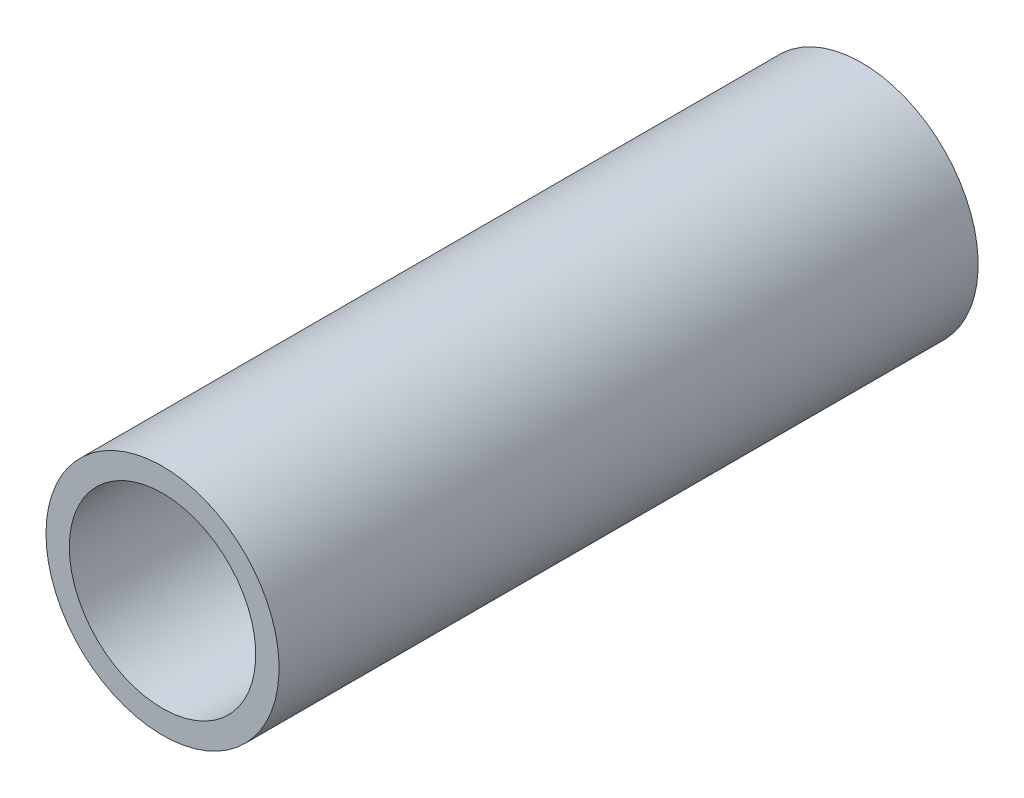
ISO-10303-21;
HEADER;
FILE_DESCRIPTION(('STEP AP214'),'2;1');
FILE_NAME('part.step','',(''),(''),'','','');
FILE_SCHEMA(('AUTOMOTIVE_DESIGN { 1 0 10303 214 1 1 1 1 }'));
ENDSEC;
DATA;
#1=APPLICATION_CONTEXT('core data for automotive mechanical design processes');
#2=APPLICATION_PROTOCOL_DEFINITION('international standard','automotive_design',2000,#1);
#3=PRODUCT_CONTEXT('',#1,'mechanical');
#4=PRODUCT('Part','Part','',(#3));
#5=PRODUCT_RELATED_PRODUCT_CATEGORY('part','',(#4));
#6=PRODUCT_DEFINITION_FORMATION('','',#4);
#7=PRODUCT_DEFINITION_CONTEXT('part definition',#1,'design');
#8=PRODUCT_DEFINITION('design','',#6,#7);
#9=PRODUCT_DEFINITION_SHAPE('','',#8);
#10=(LENGTH_UNIT() NAMED_UNIT(*) SI_UNIT(.MILLI.,.METRE.));
#11=(NAMED_UNIT(*) PLANE_ANGLE_UNIT() SI_UNIT($,.RADIAN.));
#12=(NAMED_UNIT(*) SI_UNIT($,.STERADIAN.) SOLID_ANGLE_UNIT());
#13=UNCERTAINTY_MEASURE_WITH_UNIT(LENGTH_MEASURE(1.E-05),#10,'distance_accuracy_value','');
#14=(GEOMETRIC_REPRESENTATION_CONTEXT(3) GLOBAL_UNCERTAINTY_ASSIGNED_CONTEXT((#13)) GLOBAL_UNIT_ASSIGNED_CONTEXT((#10,
#11,#12)) REPRESENTATION_CONTEXT('',''));
#15=CARTESIAN_POINT('',(0.,0.,0.));
#16=DIRECTION('',(0.,0.,1.));
#17=DIRECTION('',(1.,0.,0.));
#18=AXIS2_PLACEMENT_3D('',#15,#16,#17);
#19=CARTESIAN_POINT('',(0.,0.,45.));
#20=DIRECTION('',(0.,0.,1.));
#21=DIRECTION('',(1.,0.,0.));
#22=AXIS2_PLACEMENT_3D('',#19,#20,#21);
#23=PLANE('',#22);
#24=CARTESIAN_POINT('',(0.,0.,45.));
#25=DIRECTION('',(0.,0.,1.));
#26=DIRECTION('',(1.,0.,0.));
#27=AXIS2_PLACEMENT_3D('',#24,#25,#26);
#28=CIRCLE('',#27,7.5);
#29=CARTESIAN_POINT('',(-7.5,0.,45.));
#30=VERTEX_POINT('',#29);
#31=EDGE_CURVE('E10',#30,#30,#28,.T.);
#32=ORIENTED_EDGE('',*,*,#31,.T.);
#33=EDGE_LOOP('',(#32));
#34=FACE_BOUND('',#33,.T.);
#35=CARTESIAN_POINT('',(0.,0.,45.));
#36=DIRECTION('',(0.,0.,1.));
#37=DIRECTION('',(1.,0.,0.));
#38=AXIS2_PLACEMENT_3D('',#35,#36,#37);
#39=CIRCLE('',#38,6.);
#40=CARTESIAN_POINT('',(-6.,0.,45.));
#41=VERTEX_POINT('',#40);
#42=EDGE_CURVE('E42',#41,#41,#39,.T.);
#43=ORIENTED_EDGE('',*,*,#42,.F.);
#44=EDGE_LOOP('',(#43));
#45=FACE_BOUND('',#44,.T.);
#46=ADVANCED_FACE('F31',(#34,#45),#23,.T.);
#47=CARTESIAN_POINT('',(0.,0.,0.));
#48=DIRECTION('',(0.,0.,1.));
#49=DIRECTION('',(1.,0.,0.));
#50=AXIS2_PLACEMENT_3D('',#47,#48,#49);
#51=PLANE('',#50);
#52=CARTESIAN_POINT('',(0.,0.,0.));
#53=DIRECTION('',(0.,0.,1.));
#54=DIRECTION('',(1.,0.,0.));
#55=AXIS2_PLACEMENT_3D('',#52,#53,#54);
#56=CIRCLE('',#55,7.5);
#57=CARTESIAN_POINT('',(-7.5,0.,0.));
#58=VERTEX_POINT('',#57);
#59=EDGE_CURVE('E35',#58,#58,#56,.T.);
#60=ORIENTED_EDGE('',*,*,#59,.F.);
#61=EDGE_LOOP('',(#60));
#62=FACE_BOUND('',#61,.T.);
#63=CARTESIAN_POINT('',(0.,0.,0.));
#64=DIRECTION('',(0.,0.,1.));
#65=DIRECTION('',(1.,0.,0.));
#66=AXIS2_PLACEMENT_3D('',#63,#64,#65);
#67=CIRCLE('',#66,6.);
#68=CARTESIAN_POINT('',(-6.,0.,0.));
#69=VERTEX_POINT('',#68);
#70=EDGE_CURVE('E44',#69,#69,#67,.T.);
#71=ORIENTED_EDGE('',*,*,#70,.T.);
#72=EDGE_LOOP('',(#71));
#73=FACE_BOUND('',#72,.T.);
#74=ADVANCED_FACE('F54',(#62,#73),#51,.F.);
#75=CARTESIAN_POINT('',(0.,0.,45.));
#76=DIRECTION('',(0.,0.,-1.));
#77=DIRECTION('',(-1.,0.,0.));
#78=AXIS2_PLACEMENT_3D('',#75,#76,#77);
#79=CYLINDRICAL_SURFACE('',#78,7.5);
#80=CARTESIAN_POINT('',(-7.5,0.,45.));
#81=CARTESIAN_POINT('',(-7.5,0.,44.53125));
#82=CARTESIAN_POINT('',(-7.5,0.,44.0625));
#83=CARTESIAN_POINT('',(-7.5,0.,43.125));
#84=CARTESIAN_POINT('',(-7.5,0.,42.65625));
#85=CARTESIAN_POINT('',(-7.5,0.,41.71875));
#86=CARTESIAN_POINT('',(-7.5,0.,41.25));
#87=CARTESIAN_POINT('',(-7.5,0.,40.3125));
#88=CARTESIAN_POINT('',(-7.5,0.,39.84375));
#89=CARTESIAN_POINT('',(-7.5,0.,38.90625));
#90=CARTESIAN_POINT('',(-7.5,0.,38.4375));
#91=CARTESIAN_POINT('',(-7.5,0.,37.5));
#92=CARTESIAN_POINT('',(-7.5,0.,37.03125));
#93=CARTESIAN_POINT('',(-7.5,0.,36.09375));
#94=CARTESIAN_POINT('',(-7.5,0.,35.625));
#95=CARTESIAN_POINT('',(-7.5,0.,34.6875));
#96=CARTESIAN_POINT('',(-7.5,0.,34.21875));
#97=CARTESIAN_POINT('',(-7.5,0.,33.28125));
#98=CARTESIAN_POINT('',(-7.5,0.,32.8125));
#99=CARTESIAN_POINT('',(-7.5,0.,31.875));
#100=CARTESIAN_POINT('',(-7.5,0.,31.40625));
#101=CARTESIAN_POINT('',(-7.5,0.,30.46875));
#102=CARTESIAN_POINT('',(-7.5,0.,30.));
#103=CARTESIAN_POINT('',(-7.5,0.,29.0625));
#104=CARTESIAN_POINT('',(-7.5,0.,28.59375));
#105=CARTESIAN_POINT('',(-7.5,0.,27.65625));
#106=CARTESIAN_POINT('',(-7.5,0.,27.1875));
#107=CARTESIAN_POINT('',(-7.5,0.,26.25));
#108=CARTESIAN_POINT('',(-7.5,0.,25.78125));
#109=CARTESIAN_POINT('',(-7.5,0.,24.84375));
#110=CARTESIAN_POINT('',(-7.5,0.,24.375));
#111=CARTESIAN_POINT('',(-7.5,0.,23.4375));
#112=CARTESIAN_POINT('',(-7.5,0.,22.96875));
#113=CARTESIAN_POINT('',(-7.5,0.,22.03125));
#114=CARTESIAN_POINT('',(-7.5,0.,21.5625));
#115=CARTESIAN_POINT('',(-7.5,0.,20.625));
#116=CARTESIAN_POINT('',(-7.5,0.,20.15625));
#117=CARTESIAN_POINT('',(-7.5,0.,19.21875));
#118=CARTESIAN_POINT('',(-7.5,0.,18.75));
#119=CARTESIAN_POINT('',(-7.5,0.,17.8125));
#120=CARTESIAN_POINT('',(-7.5,0.,17.34375));
#121=CARTESIAN_POINT('',(-7.5,0.,16.40625));
#122=CARTESIAN_POINT('',(-7.5,0.,15.9375));
#123=CARTESIAN_POINT('',(-7.5,0.,15.));
#124=CARTESIAN_POINT('',(-7.5,0.,14.53125));
#125=CARTESIAN_POINT('',(-7.5,0.,13.59375));
#126=CARTESIAN_POINT('',(-7.5,0.,13.125));
#127=CARTESIAN_POINT('',(-7.5,0.,12.1875));
#128=CARTESIAN_POINT('',(-7.5,0.,11.71875));
#129=CARTESIAN_POINT('',(-7.5,0.,10.78125));
#130=CARTESIAN_POINT('',(-7.5,0.,10.3125));
#131=CARTESIAN_POINT('',(-7.5,0.,9.37499999999999));
#132=CARTESIAN_POINT('',(-7.5,0.,8.90624999999999));
#133=CARTESIAN_POINT('',(-7.5,0.,7.96874999999999));
#134=CARTESIAN_POINT('',(-7.5,0.,7.5));
#135=CARTESIAN_POINT('',(-7.5,0.,6.56249999999999));
#136=CARTESIAN_POINT('',(-7.5,0.,6.09374999999999));
#137=CARTESIAN_POINT('',(-7.5,0.,5.15624999999999));
#138=CARTESIAN_POINT('',(-7.5,0.,4.68749999999999));
#139=CARTESIAN_POINT('',(-7.5,0.,3.74999999999999));
#140=CARTESIAN_POINT('',(-7.5,0.,3.28124999999999));
#141=CARTESIAN_POINT('',(-7.5,0.,2.34374999999999));
#142=CARTESIAN_POINT('',(-7.5,0.,1.87499999999999));
#143=CARTESIAN_POINT('',(-7.5,0.,0.937499999999992));
#144=CARTESIAN_POINT('',(-7.5,0.,0.468749999999993));
#145=CARTESIAN_POINT('',(-7.5,0.,0.));
#146=B_SPLINE_CURVE_WITH_KNOTS('',3,(#80,#81,#82,#83,#84,#85,#86,#87,#88,#89,#90,#91,#92,#93,
#94,#95,#96,#97,#98,#99,#100,#101,#102,#103,#104,#105,#106,#107,#108,#109,#110,#111,#112,#113,
#114,#115,#116,#117,#118,#119,#120,#121,#122,#123,#124,#125,#126,#127,#128,#129,#130,#131,#132,
#133,#134,#135,#136,#137,#138,#139,#140,#141,#142,#143,#144,#145),.UNSPECIFIED.,.F.,.F.,(4,2,2,
2,2,2,2,2,2,2,2,2,2,2,2,2,2,2,2,2,2,2,2,2,2,2,2,2,2,2,2,2,4),(0.,1.40625,2.8125,
4.21874999999999,5.625,7.03125,8.43749999999999,9.84375,11.25,12.65625,14.0625,15.46875,16.875,
18.28125,19.6875,21.09375,22.5,23.90625,25.3125,26.71875,28.125,29.53125,30.9375,32.34375,33.75,
35.15625,36.5625,37.96875,39.375,40.78125,42.1875,43.59375,45.),.UNSPECIFIED.);
#147=EDGE_CURVE('BSEAM33',#30,#58,#146,.T.);
#148=ORIENTED_EDGE('',*,*,#31,.F.);
#149=ORIENTED_EDGE('',*,*,#59,.T.);
#150=ORIENTED_EDGE('',*,*,#147,.T.);
#151=ORIENTED_EDGE('',*,*,#147,.F.);
#152=EDGE_LOOP('',(#148,#150,#149,#151));
#153=FACE_BOUND('',#152,.T.);
#154=ADVANCED_FACE('F33',(#153),#79,.T.);
#155=CARTESIAN_POINT('',(0.,0.,45.));
#156=DIRECTION('',(0.,0.,-1.));
#157=DIRECTION('',(-1.,0.,0.));
#158=AXIS2_PLACEMENT_3D('',#155,#156,#157);
#159=CYLINDRICAL_SURFACE('',#158,6.);
#160=CARTESIAN_POINT('',(-6.,0.,45.));
#161=CARTESIAN_POINT('',(-6.,0.,44.53125));
#162=CARTESIAN_POINT('',(-6.,0.,44.0625));
#163=CARTESIAN_POINT('',(-6.,0.,43.125));
#164=CARTESIAN_POINT('',(-6.,0.,42.65625));
#165=CARTESIAN_POINT('',(-6.,0.,41.71875));
#166=CARTESIAN_POINT('',(-6.,0.,41.25));
#167=CARTESIAN_POINT('',(-6.,0.,40.3125));
#168=CARTESIAN_POINT('',(-6.,0.,39.84375));
#169=CARTESIAN_POINT('',(-6.,0.,38.90625));
#170=CARTESIAN_POINT('',(-6.,0.,38.4375));
#171=CARTESIAN_POINT('',(-6.,0.,37.5));
#172=CARTESIAN_POINT('',(-6.,0.,37.03125));
#173=CARTESIAN_POINT('',(-6.,0.,36.09375));
#174=CARTESIAN_POINT('',(-6.,0.,35.625));
#175=CARTESIAN_POINT('',(-6.,0.,34.6875));
#176=CARTESIAN_POINT('',(-6.,0.,34.21875));
#177=CARTESIAN_POINT('',(-6.,0.,33.28125));
#178=CARTESIAN_POINT('',(-6.,0.,32.8125));
#179=CARTESIAN_POINT('',(-6.,0.,31.875));
#180=CARTESIAN_POINT('',(-6.,0.,31.40625));
#181=CARTESIAN_POINT('',(-6.,0.,30.46875));
#182=CARTESIAN_POINT('',(-6.,0.,30.));
#183=CARTESIAN_POINT('',(-6.,0.,29.0625));
#184=CARTESIAN_POINT('',(-6.,0.,28.59375));
#185=CARTESIAN_POINT('',(-6.,0.,27.65625));
#186=CARTESIAN_POINT('',(-6.,0.,27.1875));
#187=CARTESIAN_POINT('',(-6.,0.,26.25));
#188=CARTESIAN_POINT('',(-6.,0.,25.78125));
#189=CARTESIAN_POINT('',(-6.,0.,24.84375));
#190=CARTESIAN_POINT('',(-6.,0.,24.375));
#191=CARTESIAN_POINT('',(-6.,0.,23.4375));
#192=CARTESIAN_POINT('',(-6.,0.,22.96875));
#193=CARTESIAN_POINT('',(-6.,0.,22.03125));
#194=CARTESIAN_POINT('',(-6.,0.,21.5625));
#195=CARTESIAN_POINT('',(-6.,0.,20.625));
#196=CARTESIAN_POINT('',(-6.,0.,20.15625));
#197=CARTESIAN_POINT('',(-6.,0.,19.21875));
#198=CARTESIAN_POINT('',(-6.,0.,18.75));
#199=CARTESIAN_POINT('',(-6.,0.,17.8125));
#200=CARTESIAN_POINT('',(-6.,0.,17.34375));
#201=CARTESIAN_POINT('',(-6.,0.,16.40625));
#202=CARTESIAN_POINT('',(-6.,0.,15.9375));
#203=CARTESIAN_POINT('',(-6.,0.,15.));
#204=CARTESIAN_POINT('',(-6.,0.,14.53125));
#205=CARTESIAN_POINT('',(-6.,0.,13.59375));
#206=CARTESIAN_POINT('',(-6.,0.,13.125));
#207=CARTESIAN_POINT('',(-6.,0.,12.1875));
#208=CARTESIAN_POINT('',(-6.,0.,11.71875));
#209=CARTESIAN_POINT('',(-6.,0.,10.78125));
#210=CARTESIAN_POINT('',(-6.,0.,10.3125));
#211=CARTESIAN_POINT('',(-6.,0.,9.37499999999999));
#212=CARTESIAN_POINT('',(-6.,0.,8.90624999999999));
#213=CARTESIAN_POINT('',(-6.,0.,7.96874999999999));
#214=CARTESIAN_POINT('',(-6.,0.,7.5));
#215=CARTESIAN_POINT('',(-6.,0.,6.56249999999999));
#216=CARTESIAN_POINT('',(-6.,0.,6.09374999999999));
#217=CARTESIAN_POINT('',(-6.,0.,5.15624999999999));
#218=CARTESIAN_POINT('',(-6.,0.,4.68749999999999));
#219=CARTESIAN_POINT('',(-6.,0.,3.74999999999999));
#220=CARTESIAN_POINT('',(-6.,0.,3.28124999999999));
#221=CARTESIAN_POINT('',(-6.,0.,2.34374999999999));
#222=CARTESIAN_POINT('',(-6.,0.,1.87499999999999));
#223=CARTESIAN_POINT('',(-6.,0.,0.937499999999992));
#224=CARTESIAN_POINT('',(-6.,0.,0.468749999999993));
#225=CARTESIAN_POINT('',(-6.,0.,0.));
#226=B_SPLINE_CURVE_WITH_KNOTS('',3,(#160,#161,#162,#163,#164,#165,#166,#167,#168,#169,#170,
#171,#172,#173,#174,#175,#176,#177,#178,#179,#180,#181,#182,#183,#184,#185,#186,#187,#188,#189,
#190,#191,#192,#193,#194,#195,#196,#197,#198,#199,#200,#201,#202,#203,#204,#205,#206,#207,#208,
#209,#210,#211,#212,#213,#214,#215,#216,#217,#218,#219,#220,#221,#222,#223,#224,#225),
.UNSPECIFIED.,.F.,.F.,(4,2,2,2,2,2,2,2,2,2,2,2,2,2,2,2,2,2,2,2,2,2,2,2,2,2,2,2,2,2,2,2,4),(0.,
1.40625,2.8125,4.21874999999999,5.625,7.03125,8.43749999999999,9.84375,11.25,12.65625,14.0625,
15.46875,16.875,18.28125,19.6875,21.09375,22.5,23.90625,25.3125,26.71875,28.125,29.53125,
30.9375,32.34375,33.75,35.15625,36.5625,37.96875,39.375,40.78125,42.1875,43.59375,45.),.UNSPECIFIED.);
#227=EDGE_CURVE('BSEAM50',#41,#69,#226,.T.);
#228=ORIENTED_EDGE('',*,*,#42,.T.);
#229=ORIENTED_EDGE('',*,*,#70,.F.);
#230=ORIENTED_EDGE('',*,*,#227,.T.);
#231=ORIENTED_EDGE('',*,*,#227,.F.);
#232=EDGE_LOOP('',(#228,#230,#229,#231));
#233=FACE_BOUND('',#232,.T.);
#234=ADVANCED_FACE('F50',(#233),#159,.F.);
#235=CLOSED_SHELL('',(#46,#74,#154,#234));
#236=MANIFOLD_SOLID_BREP('B2',#235);
#237=ADVANCED_BREP_SHAPE_REPRESENTATION('',(#18,#236),#14);
#238=SHAPE_DEFINITION_REPRESENTATION(#9,#237);
ENDSEC;
END-ISO-10303-21;
